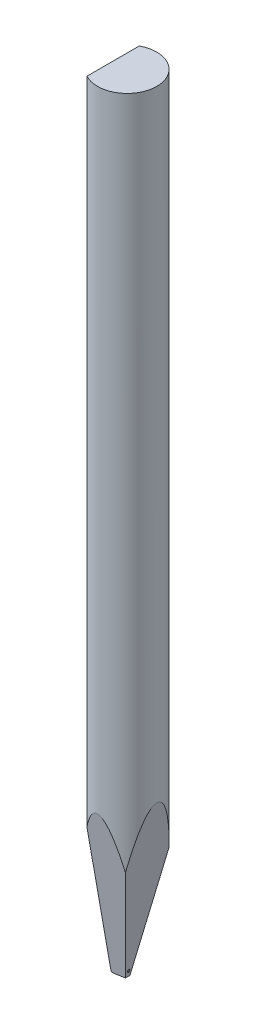
ISO-10303-21;
HEADER;
FILE_DESCRIPTION(('STEP AP214'),'2;1');
FILE_NAME('part.step','',(''),(''),'','','');
FILE_SCHEMA(('AUTOMOTIVE_DESIGN { 1 0 10303 214 1 1 1 1 }'));
ENDSEC;
DATA;
#1=APPLICATION_CONTEXT('core data for automotive mechanical design processes');
#2=APPLICATION_PROTOCOL_DEFINITION('international standard','automotive_design',2000,#1);
#3=PRODUCT_CONTEXT('',#1,'mechanical');
#4=PRODUCT('Part','Part','',(#3));
#5=PRODUCT_RELATED_PRODUCT_CATEGORY('part','',(#4));
#6=PRODUCT_DEFINITION_FORMATION('','',#4);
#7=PRODUCT_DEFINITION_CONTEXT('part definition',#1,'design');
#8=PRODUCT_DEFINITION('design','',#6,#7);
#9=PRODUCT_DEFINITION_SHAPE('','',#8);
#10=(LENGTH_UNIT() NAMED_UNIT(*) SI_UNIT(.MILLI.,.METRE.));
#11=(NAMED_UNIT(*) PLANE_ANGLE_UNIT() SI_UNIT($,.RADIAN.));
#12=(NAMED_UNIT(*) SI_UNIT($,.STERADIAN.) SOLID_ANGLE_UNIT());
#13=UNCERTAINTY_MEASURE_WITH_UNIT(LENGTH_MEASURE(1.E-05),#10,'distance_accuracy_value','');
#14=(GEOMETRIC_REPRESENTATION_CONTEXT(3) GLOBAL_UNCERTAINTY_ASSIGNED_CONTEXT((#13)) GLOBAL_UNIT_ASSIGNED_CONTEXT((#10,
#11,#12)) REPRESENTATION_CONTEXT('',''));
#15=CARTESIAN_POINT('',(0.,0.,0.));
#16=DIRECTION('',(0.,0.,1.));
#17=DIRECTION('',(1.,0.,0.));
#18=AXIS2_PLACEMENT_3D('',#15,#16,#17);
#19=CARTESIAN_POINT('',(0.,0.,0.));
#20=DIRECTION('',(0.,1.,0.));
#21=DIRECTION('',(0.,0.,1.));
#22=AXIS2_PLACEMENT_3D('',#19,#20,#21);
#23=PLANE('',#22);
#24=DIRECTION('',(1.,0.,0.));
#25=VECTOR('',#24,1.);
#26=CARTESIAN_POINT('',(-0.37592,0.,0.01397));
#27=LINE('',#26,#25);
#28=CARTESIAN_POINT('',(-0.34798,0.,0.0139699999999995));
#29=VERTEX_POINT('',#28);
#30=CARTESIAN_POINT('',(-0.305045479258089,0.,0.01397));
#31=VERTEX_POINT('',#30);
#32=EDGE_CURVE('E374',#29,#31,#27,.T.);
#33=ORIENTED_EDGE('',*,*,#32,.T.);
#34=CARTESIAN_POINT('',(-0.280550606325167,0.,0.));
#35=DIRECTION('',(0.,1.,0.));
#36=DIRECTION('',(-1.,0.,0.));
#37=AXIS2_PLACEMENT_3D('',#34,#35,#36);
#38=ELLIPSE('',#37,0.0293293936748331,0.0254);
#39=CARTESIAN_POINT('',(-0.28702,0.,0.024774386150013));
#40=VERTEX_POINT('',#39);
#41=EDGE_CURVE('E200',#40,#31,#38,.F.);
#42=ORIENTED_EDGE('',*,*,#41,.F.);
#43=DIRECTION('',(0.,0.,-1.));
#44=VECTOR('',#43,1.);
#45=CARTESIAN_POINT('',(-0.28702,0.,27.2760283406468));
#46=LINE('',#45,#44);
#47=CARTESIAN_POINT('',(-0.287019999999996,0.,0.0508));
#48=VERTEX_POINT('',#47);
#49=EDGE_CURVE('E271',#48,#40,#46,.T.);
#50=ORIENTED_EDGE('',*,*,#49,.F.);
#51=DIRECTION('',(-1.,0.,0.));
#52=VECTOR('',#51,1.);
#53=CARTESIAN_POINT('',(26.8738719491216,0.,0.0508));
#54=LINE('',#53,#52);
#55=CARTESIAN_POINT('',(-0.34798,0.,0.0508000000000009));
#56=VERTEX_POINT('',#55);
#57=EDGE_CURVE('E289',#48,#56,#54,.T.);
#58=ORIENTED_EDGE('',*,*,#57,.T.);
#59=DIRECTION('',(0.,0.,-1.));
#60=VECTOR('',#59,1.);
#61=CARTESIAN_POINT('',(-0.34798,0.,26.4674719491216));
#62=LINE('',#61,#60);
#63=EDGE_CURVE('E365',#56,#29,#62,.T.);
#64=ORIENTED_EDGE('',*,*,#63,.T.);
#65=EDGE_LOOP('',(#33,#42,#50,#58,#64));
#66=FACE_BOUND('',#65,.T.);
#67=ADVANCED_FACE('F43',(#66),#23,.F.);
#68=CARTESIAN_POINT('',(26.8738719491216,0.,0.0508));
#69=DIRECTION('',(0.,-0.173648177666931,0.984807753012208));
#70=DIRECTION('',(0.,-0.984807753012208,-0.173648177666931));
#71=AXIS2_PLACEMENT_3D('',#68,#69,#70);
#72=PLANE('',#71);
#73=CARTESIAN_POINT('',(-0.34798,0.02794,0.0557265758409954));
#74=DIRECTION('',(0.,-0.173648177666931,0.984807753012208));
#75=DIRECTION('',(0.,-0.984807753012208,-0.173648177666931));
#76=AXIS2_PLACEMENT_3D('',#73,#74,#75);
#77=ELLIPSE('',#76,0.0283710195360877,0.02794);
#78=CARTESIAN_POINT('',(-0.37592,0.02794,0.0557265758409954));
#79=VERTEX_POINT('',#78);
#80=EDGE_CURVE('E277',#56,#79,#77,.F.);
#81=ORIENTED_EDGE('',*,*,#80,.F.);
#82=ORIENTED_EDGE('',*,*,#57,.F.);
#83=DIRECTION('',(-0.984346441568213,-0.173566836012845,-0.0306045161452665));
#84=VECTOR('',#83,1.);
#85=CARTESIAN_POINT('',(26.0301980698046,4.64043560289492,0.869033999030531));
#86=LINE('',#85,#84);
#87=CARTESIAN_POINT('',(0.0144531636701099,0.0531578527145794,0.060173163670107));
#88=VERTEX_POINT('',#87);
#89=EDGE_CURVE('E286',#88,#48,#86,.T.);
#90=ORIENTED_EDGE('',*,*,#89,.F.);
#91=DIRECTION('',(-0.171087869746036,-0.970287525247814,-0.171087869746036));
#92=VECTOR('',#91,1.);
#93=CARTESIAN_POINT('',(0.791557999082992,4.46033837772866,0.837277999082991));
#94=LINE('',#93,#92);
#95=CARTESIAN_POINT('',(0.537041505266774,3.0169036135559,0.582761505266773));
#96=VERTEX_POINT('',#95);
#97=EDGE_CURVE('E283',#96,#88,#94,.T.);
#98=ORIENTED_EDGE('',*,*,#97,.F.);
#99=CARTESIAN_POINT('',(0.,-0.288101116436578,0.));
#100=DIRECTION('',(0.,-0.173648177666931,0.984807753012208));
#101=DIRECTION('',(0.,-0.984807753012208,-0.173648177666931));
#102=AXIS2_PLACEMENT_3D('',#99,#100,#101);
#103=ELLIPSE('',#102,4.56371043248163,0.792479999999998);
#104=CARTESIAN_POINT('',(-0.37592,3.66844093071414,0.69764511322018));
#105=VERTEX_POINT('',#104);
#106=EDGE_CURVE('E293',#96,#105,#103,.T.);
#107=ORIENTED_EDGE('',*,*,#106,.T.);
#108=DIRECTION('',(0.,0.984807753012208,0.173648177666931));
#109=VECTOR('',#108,1.);
#110=CARTESIAN_POINT('',(-0.37592,20.2093857917021,3.6142599786234));
#111=LINE('',#110,#109);
#112=EDGE_CURVE('E308',#79,#105,#111,.T.);
#113=ORIENTED_EDGE('',*,*,#112,.F.);
#114=EDGE_LOOP('',(#81,#82,#90,#98,#107,#113));
#115=FACE_BOUND('',#114,.T.);
#116=ADVANCED_FACE('F238',(#115),#72,.T.);
#117=CARTESIAN_POINT('',(26.8738719491216,0.,-0.0508));
#118=DIRECTION('',(0.,-0.173648177666931,-0.984807753012208));
#119=DIRECTION('',(0.,0.984807753012208,-0.173648177666931));
#120=AXIS2_PLACEMENT_3D('',#117,#118,#119);
#121=PLANE('',#120);
#122=CARTESIAN_POINT('',(-0.34798,0.02794,-0.0557265758409919));
#123=DIRECTION('',(0.,-0.173648177666931,-0.984807753012208));
#124=DIRECTION('',(0.,0.984807753012208,-0.173648177666931));
#125=AXIS2_PLACEMENT_3D('',#122,#123,#124);
#126=ELLIPSE('',#125,0.0283710195360877,0.02794);
#127=CARTESIAN_POINT('',(-0.37592,0.02794,-0.0557265758409919));
#128=VERTEX_POINT('',#127);
#129=CARTESIAN_POINT('',(-0.34798,0.,-0.0508000000000002));
#130=VERTEX_POINT('',#129);
#131=EDGE_CURVE('E318',#128,#130,#126,.F.);
#132=ORIENTED_EDGE('',*,*,#131,.F.);
#133=DIRECTION('',(0.,-0.984807753012208,0.173648177666931));
#134=VECTOR('',#133,1.);
#135=CARTESIAN_POINT('',(-0.37592,20.5673030312895,-3.67737044482337));
#136=LINE('',#135,#134);
#137=CARTESIAN_POINT('',(-0.37592,3.66844093071414,-0.69764511322018));
#138=VERTEX_POINT('',#137);
#139=EDGE_CURVE('E310',#138,#128,#136,.T.);
#140=ORIENTED_EDGE('',*,*,#139,.F.);
#141=CARTESIAN_POINT('',(0.,-0.288101116436578,0.));
#142=DIRECTION('',(0.,-0.173648177666931,-0.984807753012208));
#143=DIRECTION('',(0.,-0.984807753012208,0.173648177666931));
#144=AXIS2_PLACEMENT_3D('',#141,#142,#143);
#145=ELLIPSE('',#144,4.56371043248163,0.792479999999998);
#146=CARTESIAN_POINT('',(0.537041505266774,3.0169036135559,-0.582761505266773));
#147=VERTEX_POINT('',#146);
#148=EDGE_CURVE('E296',#138,#147,#145,.T.);
#149=ORIENTED_EDGE('',*,*,#148,.T.);
#150=DIRECTION('',(0.171087869746036,0.970287525247814,-0.171087869746036));
#151=VECTOR('',#150,1.);
#152=CARTESIAN_POINT('',(0.791557999082992,4.46033837772866,-0.837277999082991));
#153=LINE('',#152,#151);
#154=CARTESIAN_POINT('',(0.0144531636701099,0.0531578527145794,-0.060173163670107));
#155=VERTEX_POINT('',#154);
#156=EDGE_CURVE('E313',#155,#147,#153,.T.);
#157=ORIENTED_EDGE('',*,*,#156,.F.);
#158=DIRECTION('',(0.984346441568213,0.173566836012845,-0.0306045161452665));
#159=VECTOR('',#158,1.);
#160=CARTESIAN_POINT('',(26.0301980698046,4.64043560289492,-0.869033999030531));
#161=LINE('',#160,#159);
#162=CARTESIAN_POINT('',(-0.287019999999996,0.,-0.0508));
#163=VERTEX_POINT('',#162);
#164=EDGE_CURVE('E316',#163,#155,#161,.T.);
#165=ORIENTED_EDGE('',*,*,#164,.F.);
#166=DIRECTION('',(-1.,0.,0.));
#167=VECTOR('',#166,1.);
#168=CARTESIAN_POINT('',(26.8738719491216,0.,-0.0508));
#169=LINE('',#168,#167);
#170=EDGE_CURVE('E266',#163,#130,#169,.T.);
#171=ORIENTED_EDGE('',*,*,#170,.T.);
#172=EDGE_LOOP('',(#132,#140,#149,#157,#165,#171));
#173=FACE_BOUND('',#172,.T.);
#174=ADVANCED_FACE('F244',(#173),#121,.T.);
#175=CARTESIAN_POINT('',(-0.28702,0.,-0.024774386150013));
#176=VERTEX_POINT('',#175);
#177=EDGE_CURVE('E262',#176,#163,#46,.T.);
#178=ORIENTED_EDGE('',*,*,#177,.F.);
#179=CARTESIAN_POINT('',(-0.305045479258089,0.,-0.01397));
#180=VERTEX_POINT('',#179);
#181=EDGE_CURVE('E198',#180,#176,#38,.F.);
#182=ORIENTED_EDGE('',*,*,#181,.F.);
#183=DIRECTION('',(1.,0.,0.));
#184=VECTOR('',#183,1.);
#185=CARTESIAN_POINT('',(-0.37592,0.,-0.01397));
#186=LINE('',#185,#184);
#187=CARTESIAN_POINT('',(-0.34798,0.,-0.013970000000003));
#188=VERTEX_POINT('',#187);
#189=EDGE_CURVE('E372',#188,#180,#186,.T.);
#190=ORIENTED_EDGE('',*,*,#189,.F.);
#191=EDGE_CURVE('E368',#188,#130,#62,.T.);
#192=ORIENTED_EDGE('',*,*,#191,.T.);
#193=ORIENTED_EDGE('',*,*,#170,.F.);
#194=EDGE_LOOP('',(#178,#182,#190,#192,#193));
#195=FACE_BOUND('',#194,.T.);
#196=ADVANCED_FACE('F240',(#195),#23,.F.);
#197=CARTESIAN_POINT('',(0.,21.0312,0.));
#198=DIRECTION('',(0.,-1.,0.));
#199=DIRECTION('',(0.,0.,-1.));
#200=AXIS2_PLACEMENT_3D('',#197,#198,#199);
#201=CYLINDRICAL_SURFACE('',#200,0.792479999999998);
#202=ORIENTED_EDGE('',*,*,#106,.F.);
#203=CARTESIAN_POINT('',(0.,-0.0288101116436568,0.));
#204=DIRECTION('',(-0.984807753012208,0.173648177666931,0.));
#205=DIRECTION('',(-0.173648177666931,-0.984807753012208,0.));
#206=AXIS2_PLACEMENT_3D('',#203,#204,#205);
#207=ELLIPSE('',#206,4.56371043248164,0.792479999999998);
#208=EDGE_CURVE('E275',#96,#147,#207,.T.);
#209=ORIENTED_EDGE('',*,*,#208,.T.);
#210=ORIENTED_EDGE('',*,*,#148,.F.);
#211=DIRECTION('',(0.,-1.,0.));
#212=VECTOR('',#211,1.);
#213=CARTESIAN_POINT('',(-0.37592,21.0312,-0.69764511322018));
#214=LINE('',#213,#212);
#215=CARTESIAN_POINT('',(-0.37592,21.0312,-0.69764511322018));
#216=VERTEX_POINT('',#215);
#217=EDGE_CURVE('E302',#216,#138,#214,.T.);
#218=ORIENTED_EDGE('',*,*,#217,.F.);
#219=CARTESIAN_POINT('',(0.,21.0312,0.));
#220=DIRECTION('',(0.,1.,0.));
#221=DIRECTION('',(0.,0.,1.));
#222=AXIS2_PLACEMENT_3D('',#219,#220,#221);
#223=CIRCLE('',#222,0.792479999999998);
#224=CARTESIAN_POINT('',(-0.37592,21.0312,0.69764511322018));
#225=VERTEX_POINT('',#224);
#226=EDGE_CURVE('E305',#225,#216,#223,.T.);
#227=ORIENTED_EDGE('',*,*,#226,.F.);
#228=DIRECTION('',(0.,-1.,0.));
#229=VECTOR('',#228,1.);
#230=CARTESIAN_POINT('',(-0.37592,21.0312,0.69764511322018));
#231=LINE('',#230,#229);
#232=EDGE_CURVE('E300',#105,#225,#231,.F.);
#233=ORIENTED_EDGE('',*,*,#232,.F.);
#234=EDGE_LOOP('',(#202,#209,#210,#218,#227,#233));
#235=FACE_BOUND('',#234,.T.);
#236=ADVANCED_FACE('F45',(#235),#201,.T.);
#237=CARTESIAN_POINT('',(-0.37592,21.0312,-1.04648));
#238=DIRECTION('',(-1.,0.,0.));
#239=DIRECTION('',(0.,0.,1.));
#240=AXIS2_PLACEMENT_3D('',#237,#238,#239);
#241=PLANE('',#240);
#242=DIRECTION('',(0.,0.,-1.));
#243=VECTOR('',#242,1.);
#244=CARTESIAN_POINT('',(-0.37592,0.02794,26.4674719491216));
#245=LINE('',#244,#243);
#246=EDGE_CURVE('E356',#79,#128,#245,.T.);
#247=ORIENTED_EDGE('',*,*,#246,.F.);
#248=ORIENTED_EDGE('',*,*,#112,.T.);
#249=ORIENTED_EDGE('',*,*,#232,.T.);
#250=DIRECTION('',(0.,0.,-1.));
#251=VECTOR('',#250,1.);
#252=CARTESIAN_POINT('',(-0.37592,21.0312,-1.04648));
#253=LINE('',#252,#251);
#254=EDGE_CURVE('E298',#225,#216,#253,.T.);
#255=ORIENTED_EDGE('',*,*,#254,.T.);
#256=ORIENTED_EDGE('',*,*,#217,.T.);
#257=ORIENTED_EDGE('',*,*,#139,.T.);
#258=EDGE_LOOP('',(#247,#248,#249,#255,#256,#257));
#259=FACE_BOUND('',#258,.T.);
#260=ADVANCED_FACE('F255',(#259),#241,.T.);
#261=CARTESIAN_POINT('',(0.,21.0312,0.));
#262=DIRECTION('',(0.,1.,0.));
#263=DIRECTION('',(0.,0.,1.));
#264=AXIS2_PLACEMENT_3D('',#261,#262,#263);
#265=PLANE('',#264);
#266=ORIENTED_EDGE('',*,*,#226,.T.);
#267=ORIENTED_EDGE('',*,*,#254,.F.);
#268=EDGE_LOOP('',(#266,#267));
#269=FACE_BOUND('',#268,.T.);
#270=ADVANCED_FACE('F340',(#269),#265,.T.);
#271=CARTESIAN_POINT('',(-0.28702,0.,27.2760283406468));
#272=DIRECTION('',(-0.173648177666931,0.984807753012208,0.));
#273=DIRECTION('',(-0.984807753012208,-0.173648177666931,0.));
#274=AXIS2_PLACEMENT_3D('',#271,#272,#273);
#275=PLANE('',#274);
#276=ORIENTED_EDGE('',*,*,#49,.T.);
#277=CARTESIAN_POINT('',(-0.279817360080556,0.00127001975012591,0.));
#278=DIRECTION('',(-0.173648177666931,0.984807753012208,0.));
#279=DIRECTION('',(-0.984807753012208,-0.173648177666931,0.));
#280=AXIS2_PLACEMENT_3D('',#277,#278,#279);
#281=ELLIPSE('',#280,0.03315734514904,0.0254);
#282=CARTESIAN_POINT('',(-0.279817360080556,0.00127001975012593,0.0253999999999992));
#283=VERTEX_POINT('',#282);
#284=EDGE_CURVE('E381',#40,#283,#281,.T.);
#285=ORIENTED_EDGE('',*,*,#284,.T.);
#286=DIRECTION('',(-0.984807753012208,-0.173648177666931,0.));
#287=VECTOR('',#286,1.);
#288=CARTESIAN_POINT('',(-0.28702,0.,0.0253999999999983));
#289=LINE('',#288,#287);
#290=CARTESIAN_POINT('',(-0.11938,0.0295594550459672,0.0253999999999992));
#291=VERTEX_POINT('',#290);
#292=EDGE_CURVE('E11',#291,#283,#289,.T.);
#293=ORIENTED_EDGE('',*,*,#292,.F.);
#294=DIRECTION('',(0.,0.,1.));
#295=VECTOR('',#294,1.);
#296=CARTESIAN_POINT('',(-0.11938,0.0295594550459672,27.2760283406468));
#297=LINE('',#296,#295);
#298=CARTESIAN_POINT('',(-0.11938,0.0295594550459672,-0.0253999999999992));
#299=VERTEX_POINT('',#298);
#300=EDGE_CURVE('E51',#299,#291,#297,.T.);
#301=ORIENTED_EDGE('',*,*,#300,.F.);
#302=DIRECTION('',(-0.984807753012208,-0.173648177666931,0.));
#303=VECTOR('',#302,1.);
#304=CARTESIAN_POINT('',(-0.28702,0.,-0.0253999999999983));
#305=LINE('',#304,#303);
#306=CARTESIAN_POINT('',(-0.279817360080556,0.00127001975012592,-0.0253999999999992));
#307=VERTEX_POINT('',#306);
#308=EDGE_CURVE('E387',#299,#307,#305,.T.);
#309=ORIENTED_EDGE('',*,*,#308,.T.);
#310=EDGE_CURVE('E378',#307,#176,#281,.T.);
#311=ORIENTED_EDGE('',*,*,#310,.T.);
#312=ORIENTED_EDGE('',*,*,#177,.T.);
#313=ORIENTED_EDGE('',*,*,#164,.T.);
#314=DIRECTION('',(0.,0.,-1.));
#315=VECTOR('',#314,1.);
#316=CARTESIAN_POINT('',(0.014453163670107,0.0531578527145792,27.2760283406468));
#317=LINE('',#316,#315);
#318=EDGE_CURVE('E272',#88,#155,#317,.T.);
#319=ORIENTED_EDGE('',*,*,#318,.F.);
#320=ORIENTED_EDGE('',*,*,#89,.T.);
#321=EDGE_LOOP('',(#276,#285,#293,#301,#309,#311,#312,#313,#319,#320));
#322=FACE_BOUND('',#321,.T.);
#323=ADVANCED_FACE('F337',(#322),#275,.F.);
#324=CARTESIAN_POINT('',(0.014453163670107,0.0531578527145792,27.2760283406468));
#325=DIRECTION('',(-0.984807753012208,0.173648177666931,0.));
#326=DIRECTION('',(-0.173648177666931,-0.984807753012208,0.));
#327=AXIS2_PLACEMENT_3D('',#324,#325,#326);
#328=PLANE('',#327);
#329=CARTESIAN_POINT('',(0.0402883872120424,0.199676686293717,0.));
#330=DIRECTION('',(-0.984807753012208,0.173648177666931,0.));
#331=DIRECTION('',(0.173648177666931,0.984807753012208,0.));
#332=AXIS2_PLACEMENT_3D('',#329,#330,#331);
#333=ELLIPSE('',#332,0.0439502823592256,0.0315688581959235);
#334=CARTESIAN_POINT('',(0.047920273651669,0.242959265108158,0.));
#335=VERTEX_POINT('',#334);
#336=EDGE_CURVE('E379',#335,#335,#333,.F.);
#337=ORIENTED_EDGE('',*,*,#336,.F.);
#338=EDGE_LOOP('',(#337));
#339=FACE_BOUND('',#338,.T.);
#340=ORIENTED_EDGE('',*,*,#208,.F.);
#341=ORIENTED_EDGE('',*,*,#97,.T.);
#342=ORIENTED_EDGE('',*,*,#318,.T.);
#343=ORIENTED_EDGE('',*,*,#156,.T.);
#344=EDGE_LOOP('',(#340,#341,#342,#343));
#345=FACE_BOUND('',#344,.T.);
#346=ADVANCED_FACE('F233',(#339,#345),#328,.F.);
#347=CARTESIAN_POINT('',(-0.34798,0.02794,26.4674719491216));
#348=DIRECTION('',(0.,0.,-1.));
#349=DIRECTION('',(-1.,0.,0.));
#350=AXIS2_PLACEMENT_3D('',#347,#348,#349);
#351=CYLINDRICAL_SURFACE('',#350,0.02794);
#352=CARTESIAN_POINT('',(-0.368480727088346,0.00895674978173724,-0.00879881810244991));
#353=CARTESIAN_POINT('',(-0.368854774724931,0.00935976213087604,-0.00856686636913884));
#354=CARTESIAN_POINT('',(-0.369205920385678,0.00976379663737835,-0.00829596597274839));
#355=CARTESIAN_POINT('',(-0.369857818758494,0.010554396733079,-0.00767372073436362));
#356=CARTESIAN_POINT('',(-0.370158305071735,0.0109408626172578,-0.00732197229549094));
#357=CARTESIAN_POINT('',(-0.370701856645062,0.01167429232799,-0.00653564687871307));
#358=CARTESIAN_POINT('',(-0.370944592824748,0.0120210241938298,-0.00610061955934292));
#359=CARTESIAN_POINT('',(-0.371366457992628,0.0126475272360928,-0.00515919525147595));
#360=CARTESIAN_POINT('',(-0.371545766962167,0.0129274871364501,-0.00465300599824719));
#361=CARTESIAN_POINT('',(-0.371824486416077,0.0133747658664782,-0.00364460054899485));
#362=CARTESIAN_POINT('',(-0.371930578538492,0.0135511663748692,-0.00314824035494683));
#363=CARTESIAN_POINT('',(-0.372093482711804,0.0138258440182353,-0.002126247539729));
#364=CARTESIAN_POINT('',(-0.372150274606221,0.0139240891979024,-0.0016006030390009));
#365=CARTESIAN_POINT('',(-0.372213134357784,0.0140330808724955,-0.000570843051677341));
#366=CARTESIAN_POINT('',(-0.372222152063364,0.0140489147468615,-6.74367588038002E-05));
#367=CARTESIAN_POINT('',(-0.372197542657495,0.0140060535722678,0.000935057894392957));
#368=CARTESIAN_POINT('',(-0.372163925783508,0.0139473764149733,0.00143414726233205));
#369=CARTESIAN_POINT('',(-0.372054275035741,0.0137595786600333,0.00240799336092322));
#370=CARTESIAN_POINT('',(-0.371978732327494,0.0136312741337609,0.00288296359185759));
#371=CARTESIAN_POINT('',(-0.371785034498382,0.0133113058396997,0.00380146555967887));
#372=CARTESIAN_POINT('',(-0.371666903173099,0.0131196774578905,0.00424501468725538));
#373=CARTESIAN_POINT('',(-0.371385478248573,0.0126790651972169,0.00509691567190567));
#374=CARTESIAN_POINT('',(-0.371221477601541,0.0124291945057395,0.00550457321363247));
#375=CARTESIAN_POINT('',(-0.370849707894375,0.0118860628000233,0.00626872638313864));
#376=CARTESIAN_POINT('',(-0.37064185773786,0.0115927216938447,0.0066251251287556));
#377=CARTESIAN_POINT('',(-0.370144061183362,0.0109224002678549,0.00733922493729802));
#378=CARTESIAN_POINT('',(-0.369846095818338,0.0105398051087974,0.00768599572890581));
#379=CARTESIAN_POINT('',(-0.369199706905503,0.00975665930080781,0.00830076265321161));
#380=CARTESIAN_POINT('',(-0.368851429147325,0.00935616276418312,0.0085689798343934));
#381=CARTESIAN_POINT('',(-0.36848072714281,0.00895674981942643,0.00879881817577789));
#382=B_SPLINE_CURVE_WITH_KNOTS('',3,(#352,#353,#354,#355,#356,#357,#358,#359,#360,#361,#362,
#363,#364,#365,#366,#367,#368,#369,#370,#371,#372,#373,#374,#375,#376,#377,#378,#379,#380,#381),
.UNSPECIFIED.,.F.,.F.,(4,2,2,2,2,2,2,2,2,2,2,2,2,2,4),(0.,0.00179098902035531,
0.00359112076126628,0.00540127694248479,0.0072062546147293,0.00880987907805131,
0.0104141588775389,0.0119181182528348,0.0134217165641445,0.014908060947779,0.0163935761484805,
0.0179033875717668,0.0194160161479947,0.0211963214051743,0.0229715676894523),.UNSPECIFIED.);
#383=CARTESIAN_POINT('',(-0.368480727088347,0.00895674978173724,-0.00879881810244991));
#384=VERTEX_POINT('',#383);
#385=CARTESIAN_POINT('',(-0.368480727088346,0.00895674978173724,0.00879881810244991));
#386=VERTEX_POINT('',#385);
#387=EDGE_CURVE('E324',#384,#386,#382,.T.);
#388=ORIENTED_EDGE('',*,*,#387,.T.);
#389=CARTESIAN_POINT('',(-0.34798,0.02794,-0.0021611665211585));
#390=DIRECTION('',(0.,0.499999999999998,0.86602540378444));
#391=DIRECTION('',(0.,0.86602540378444,-0.499999999999998));
#392=AXIS2_PLACEMENT_3D('',#389,#390,#391);
#393=ELLIPSE('',#392,0.0322623330423162,0.02794);
#394=EDGE_CURVE('E331',#386,#29,#393,.T.);
#395=ORIENTED_EDGE('',*,*,#394,.T.);
#396=ORIENTED_EDGE('',*,*,#63,.F.);
#397=ORIENTED_EDGE('',*,*,#80,.T.);
#398=ORIENTED_EDGE('',*,*,#246,.T.);
#399=ORIENTED_EDGE('',*,*,#131,.T.);
#400=ORIENTED_EDGE('',*,*,#191,.F.);
#401=CARTESIAN_POINT('',(-0.34798,0.02794,0.00216116652115503));
#402=DIRECTION('',(0.,0.499999999999998,-0.86602540378444));
#403=DIRECTION('',(0.,-0.86602540378444,-0.499999999999998));
#404=AXIS2_PLACEMENT_3D('',#401,#402,#403);
#405=ELLIPSE('',#404,0.0322623330423162,0.02794);
#406=EDGE_CURVE('E321',#188,#384,#405,.T.);
#407=ORIENTED_EDGE('',*,*,#406,.T.);
#408=EDGE_LOOP('',(#388,#395,#396,#397,#398,#399,#400,#407));
#409=FACE_BOUND('',#408,.T.);
#410=ADVANCED_FACE('F225',(#409),#351,.T.);
#411=CARTESIAN_POINT('',(-0.37592,0.,0.01397));
#412=DIRECTION('',(0.,0.499999999999998,0.86602540378444));
#413=DIRECTION('',(0.,-0.86602540378444,0.499999999999998));
#414=AXIS2_PLACEMENT_3D('',#411,#412,#413);
#415=PLANE('',#414);
#416=DIRECTION('',(1.,0.,0.));
#417=VECTOR('',#416,1.);
#418=CARTESIAN_POINT('',(-0.37592,0.00895674978173724,0.00879881810244991));
#419=LINE('',#418,#417);
#420=CARTESIAN_POINT('',(-0.302892834492471,0.00895674977825219,0.00879881810446201));
#421=VERTEX_POINT('',#420);
#422=EDGE_CURVE('E375',#386,#421,#419,.T.);
#423=ORIENTED_EDGE('',*,*,#422,.T.);
#424=CARTESIAN_POINT('',(-0.266580606325167,0.0241967497817373,0.));
#425=DIRECTION('',(0.,0.499999999999998,0.86602540378444));
#426=DIRECTION('',(-0.554700196225233,-0.720576692122891,0.416025147168919));
#427=AXIS2_PLACEMENT_3D('',#424,#425,#426);
#428=ELLIPSE('',#427,0.0586587873496664,0.0254);
#429=EDGE_CURVE('E208',#421,#31,#428,.T.);
#430=ORIENTED_EDGE('',*,*,#429,.T.);
#431=ORIENTED_EDGE('',*,*,#32,.F.);
#432=ORIENTED_EDGE('',*,*,#394,.F.);
#433=EDGE_LOOP('',(#423,#430,#431,#432));
#434=FACE_BOUND('',#433,.T.);
#435=ADVANCED_FACE('F223',(#434),#415,.F.);
#436=CARTESIAN_POINT('',(-0.37592,0.00387674978173726,0.));
#437=DIRECTION('',(1.,0.,0.));
#438=DIRECTION('',(0.,0.,-1.));
#439=AXIS2_PLACEMENT_3D('',#436,#437,#438);
#440=CYLINDRICAL_SURFACE('',#439,0.01016);
#441=DIRECTION('',(1.,0.,0.));
#442=VECTOR('',#441,1.);
#443=CARTESIAN_POINT('',(-0.37592,0.00895674978173724,-0.00879881810244991));
#444=LINE('',#443,#442);
#445=CARTESIAN_POINT('',(-0.302892834491317,0.00895674978173724,-0.00879881810244991));
#446=VERTEX_POINT('',#445);
#447=EDGE_CURVE('E65',#384,#446,#444,.T.);
#448=ORIENTED_EDGE('',*,*,#447,.T.);
#449=CARTESIAN_POINT('',(-0.302892834491317,0.00895674978173674,-0.0087988181024502));
#450=CARTESIAN_POINT('',(-0.302739943050583,0.00941735974574272,-0.00853381110317959));
#451=CARTESIAN_POINT('',(-0.302608005377534,0.00986135171619135,-0.00822843561315786));
#452=CARTESIAN_POINT('',(-0.302380778864978,0.0107002844608467,-0.00754667304493423));
#453=CARTESIAN_POINT('',(-0.302285424202575,0.0110953124592045,-0.00717041534014014));
#454=CARTESIAN_POINT('',(-0.302125552407491,0.0118224551395683,-0.00635538878075599));
#455=CARTESIAN_POINT('',(-0.302061050495203,0.0121545387209327,-0.0059165892110389));
#456=CARTESIAN_POINT('',(-0.301955858096496,0.0127444430828301,-0.00498913583305599));
#457=CARTESIAN_POINT('',(-0.301915168377595,0.0130022614695008,-0.00450048041842561));
#458=CARTESIAN_POINT('',(-0.301851067836035,0.0134373405159187,-0.00348275190256002));
#459=CARTESIAN_POINT('',(-0.301827800737573,0.013613926567602,-0.00295338149596267));
#460=CARTESIAN_POINT('',(-0.30179432719949,0.0138782173570386,-0.00187241572500874));
#461=CARTESIAN_POINT('',(-0.301784123690592,0.0139659021495182,-0.00132081540215015));
#462=CARTESIAN_POINT('',(-0.301774260815354,0.0140504752256004,-0.000201768177356656));
#463=CARTESIAN_POINT('',(-0.301774771347384,0.0140459005448383,0.00036579128651018));
#464=CARTESIAN_POINT('',(-0.301786883538184,0.013942484242993,0.00149211612699328));
#465=CARTESIAN_POINT('',(-0.301798484865095,0.0138436454424987,0.00205088176623152));
#466=CARTESIAN_POINT('',(-0.301835668278414,0.0135542268308849,0.0031453692322399));
#467=CARTESIAN_POINT('',(-0.301861289947621,0.0133633874624329,0.00368102116241586));
#468=CARTESIAN_POINT('',(-0.301931852953639,0.0128957019649179,0.00471216320093632));
#469=CARTESIAN_POINT('',(-0.301976796912561,0.0126188441642258,0.00520764784756998));
#470=CARTESIAN_POINT('',(-0.302092512485198,0.0119910961003895,0.00613972310197045));
#471=CARTESIAN_POINT('',(-0.302163063848686,0.0116408476199903,0.00657677369924711));
#472=CARTESIAN_POINT('',(-0.302337373333965,0.0108775797277205,0.00738386059669966));
#473=CARTESIAN_POINT('',(-0.302441086215554,0.0104646462339143,0.00775398712648723));
#474=CARTESIAN_POINT('',(-0.302612761426613,0.00985650644583732,0.00821677131602318));
#475=CARTESIAN_POINT('',(-0.302664421027602,0.00968062590146413,0.00834187843897372));
#476=CARTESIAN_POINT('',(-0.302773923944439,0.00932294953927967,0.00857965202719807));
#477=CARTESIAN_POINT('',(-0.302831756689581,0.00914116419264679,0.00869233910822765));
#478=CARTESIAN_POINT('',(-0.302892834492505,0.00895674977827776,0.00879881810448311));
#479=B_SPLINE_CURVE_WITH_KNOTS('',3,(#449,#450,#451,#452,#453,#454,#455,#456,#457,#458,#459,
#460,#461,#462,#463,#464,#465,#466,#467,#468,#469,#470,#471,#472,#473,#474,#475,#476,#477,#478),
.UNSPECIFIED.,.F.,.F.,(4,2,2,2,2,2,2,2,2,2,2,2,2,2,4),(0.,0.00165649149420493,
0.0033099883681888,0.00496430011223509,0.00661866517535528,0.00828653161431018,
0.00995477216153838,0.0116494866121548,0.0133441503547942,0.0150436234121845,0.0167433271676665,
0.0184287453116495,0.0201118738848373,0.0207772668191028,0.021441538098197),.UNSPECIFIED.);
#480=EDGE_CURVE('E58',#446,#421,#479,.T.);
#481=ORIENTED_EDGE('',*,*,#480,.T.);
#482=ORIENTED_EDGE('',*,*,#422,.F.);
#483=ORIENTED_EDGE('',*,*,#387,.F.);
#484=EDGE_LOOP('',(#448,#481,#482,#483));
#485=FACE_BOUND('',#484,.T.);
#486=ADVANCED_FACE('F210',(#485),#440,.F.);
#487=CARTESIAN_POINT('',(-0.37592,0.00895674978173724,-0.00879881810244991));
#488=DIRECTION('',(0.,0.499999999999998,-0.86602540378444));
#489=DIRECTION('',(0.,0.86602540378444,0.499999999999998));
#490=AXIS2_PLACEMENT_3D('',#487,#488,#489);
#491=PLANE('',#490);
#492=ORIENTED_EDGE('',*,*,#189,.T.);
#493=CARTESIAN_POINT('',(-0.266580606325167,0.0241967497817373,0.));
#494=DIRECTION('',(0.,0.499999999999998,-0.86602540378444));
#495=DIRECTION('',(-0.554700196225233,-0.720576692122891,-0.416025147168919));
#496=AXIS2_PLACEMENT_3D('',#493,#494,#495);
#497=ELLIPSE('',#496,0.0586587873496664,0.0254);
#498=EDGE_CURVE('E386',#180,#446,#497,.T.);
#499=ORIENTED_EDGE('',*,*,#498,.T.);
#500=ORIENTED_EDGE('',*,*,#447,.F.);
#501=ORIENTED_EDGE('',*,*,#406,.F.);
#502=EDGE_LOOP('',(#492,#499,#500,#501));
#503=FACE_BOUND('',#502,.T.);
#504=ADVANCED_FACE('F231',(#503),#491,.F.);
#505=CARTESIAN_POINT('',(-0.11938,0.0939800000000001,0.0254));
#506=DIRECTION('',(-1.,0.,0.));
#507=DIRECTION('',(0.,0.,1.));
#508=AXIS2_PLACEMENT_3D('',#505,#506,#507);
#509=PLANE('',#508);
#510=ORIENTED_EDGE('',*,*,#300,.T.);
#511=DIRECTION('',(0.,1.,0.));
#512=VECTOR('',#511,1.);
#513=CARTESIAN_POINT('',(-0.11938,0.0939800000000001,0.0254));
#514=LINE('',#513,#512);
#515=CARTESIAN_POINT('',(-0.11938,0.0939800000000001,0.0254));
#516=VERTEX_POINT('',#515);
#517=EDGE_CURVE('E183',#291,#516,#514,.T.);
#518=ORIENTED_EDGE('',*,*,#517,.T.);
#519=DIRECTION('',(0.,0.,-1.));
#520=VECTOR('',#519,1.);
#521=CARTESIAN_POINT('',(-0.11938,0.0939800000000001,0.0254));
#522=LINE('',#521,#520);
#523=CARTESIAN_POINT('',(-0.11938,0.0939800000000001,0.01905));
#524=VERTEX_POINT('',#523);
#525=EDGE_CURVE('E170',#516,#524,#522,.T.);
#526=ORIENTED_EDGE('',*,*,#525,.T.);
#527=CARTESIAN_POINT('',(-0.11938,0.0939800000000001,0.));
#528=DIRECTION('',(1.,0.,0.));
#529=DIRECTION('',(0.,1.,0.));
#530=AXIS2_PLACEMENT_3D('',#527,#528,#529);
#531=ELLIPSE('',#530,0.0219970452561247,0.01905);
#532=CARTESIAN_POINT('',(-0.11938,0.0939800000000001,-0.0190499999999996));
#533=VERTEX_POINT('',#532);
#534=EDGE_CURVE('E162',#533,#524,#531,.F.);
#535=ORIENTED_EDGE('',*,*,#534,.F.);
#536=CARTESIAN_POINT('',(-0.11938,0.0939800000000001,-0.0254));
#537=VERTEX_POINT('',#536);
#538=EDGE_CURVE('E167',#533,#537,#522,.T.);
#539=ORIENTED_EDGE('',*,*,#538,.T.);
#540=DIRECTION('',(0.,1.,0.));
#541=VECTOR('',#540,1.);
#542=CARTESIAN_POINT('',(-0.11938,0.0939800000000001,-0.0254));
#543=LINE('',#542,#541);
#544=EDGE_CURVE('E190',#299,#537,#543,.T.);
#545=ORIENTED_EDGE('',*,*,#544,.F.);
#546=EDGE_LOOP('',(#510,#518,#526,#535,#539,#545));
#547=FACE_BOUND('',#546,.T.);
#548=ADVANCED_FACE('F164',(#547),#509,.T.);
#549=CARTESIAN_POINT('',(0.,0.,0.0254));
#550=DIRECTION('',(0.,0.,-1.));
#551=DIRECTION('',(-1.,0.,0.));
#552=AXIS2_PLACEMENT_3D('',#549,#550,#551);
#553=PLANE('',#552);
#554=ORIENTED_EDGE('',*,*,#292,.T.);
#555=DIRECTION('',(-0.500000000000004,-0.866025403784436,0.));
#556=VECTOR('',#555,1.);
#557=CARTESIAN_POINT('',(-0.210412954743874,0.121481976062362,0.0254));
#558=LINE('',#557,#556);
#559=CARTESIAN_POINT('',(-0.226291228026725,0.0939800000000001,0.0254));
#560=VERTEX_POINT('',#559);
#561=EDGE_CURVE('E185',#560,#283,#558,.T.);
#562=ORIENTED_EDGE('',*,*,#561,.F.);
#563=DIRECTION('',(-1.,0.,0.));
#564=VECTOR('',#563,1.);
#565=CARTESIAN_POINT('',(-0.255620621701558,0.0939800000000001,0.0254));
#566=LINE('',#565,#564);
#567=EDGE_CURVE('E186',#516,#560,#566,.T.);
#568=ORIENTED_EDGE('',*,*,#567,.F.);
#569=ORIENTED_EDGE('',*,*,#517,.F.);
#570=EDGE_LOOP('',(#554,#562,#568,#569));
#571=FACE_BOUND('',#570,.T.);
#572=ADVANCED_FACE('F394',(#571),#553,.T.);
#573=CARTESIAN_POINT('',(0.,0.,-0.0254));
#574=DIRECTION('',(0.,0.,-1.));
#575=DIRECTION('',(-1.,0.,0.));
#576=AXIS2_PLACEMENT_3D('',#573,#574,#575);
#577=PLANE('',#576);
#578=ORIENTED_EDGE('',*,*,#544,.T.);
#579=DIRECTION('',(-1.,0.,0.));
#580=VECTOR('',#579,1.);
#581=CARTESIAN_POINT('',(-0.255620621701558,0.0939800000000001,-0.0254));
#582=LINE('',#581,#580);
#583=CARTESIAN_POINT('',(-0.226291228026725,0.0939800000000001,-0.0254));
#584=VERTEX_POINT('',#583);
#585=EDGE_CURVE('E172',#537,#584,#582,.T.);
#586=ORIENTED_EDGE('',*,*,#585,.T.);
#587=DIRECTION('',(0.500000000000004,0.866025403784436,0.));
#588=VECTOR('',#587,1.);
#589=CARTESIAN_POINT('',(-0.226291228026725,0.0939800000000001,-0.0254));
#590=LINE('',#589,#588);
#591=EDGE_CURVE('E194',#307,#584,#590,.T.);
#592=ORIENTED_EDGE('',*,*,#591,.F.);
#593=ORIENTED_EDGE('',*,*,#308,.F.);
#594=EDGE_LOOP('',(#578,#586,#592,#593));
#595=FACE_BOUND('',#594,.T.);
#596=ADVANCED_FACE('F401',(#595),#577,.F.);
#597=CARTESIAN_POINT('',(0.0155766909287475,0.171897281836653,0.));
#598=DIRECTION('',(0.866025403784441,0.499999999999995,0.));
#599=DIRECTION('',(-0.499999999999995,0.866025403784441,0.));
#600=AXIS2_PLACEMENT_3D('',#597,#598,#599);
#601=CONICAL_SURFACE('',#600,0.01905,0.392699081698725);
#602=CARTESIAN_POINT('',(0.0155766909287475,0.171897281836653,0.));
#603=DIRECTION('',(0.866025403784441,0.499999999999995,0.));
#604=DIRECTION('',(-0.499999999999995,0.866025403784441,0.));
#605=AXIS2_PLACEMENT_3D('',#602,#603,#604);
#606=CIRCLE('',#605,0.01905);
#607=CARTESIAN_POINT('',(0.00605169092874757,0.188395065778746,0.));
#608=VERTEX_POINT('',#607);
#609=EDGE_CURVE('E178',#608,#608,#606,.T.);
#610=ORIENTED_EDGE('',*,*,#609,.F.);
#611=EDGE_LOOP('',(#610));
#612=FACE_BOUND('',#611,.T.);
#613=ORIENTED_EDGE('',*,*,#336,.T.);
#614=EDGE_LOOP('',(#613));
#615=FACE_BOUND('',#614,.T.);
#616=ADVANCED_FACE('F221',(#612,#615),#601,.F.);
#617=CARTESIAN_POINT('',(-0.226291228026725,0.0939800000000001,0.));
#618=DIRECTION('',(-0.500000000000004,-0.866025403784436,0.));
#619=DIRECTION('',(0.866025403784436,-0.500000000000004,0.));
#620=AXIS2_PLACEMENT_3D('',#617,#618,#619);
#621=CYLINDRICAL_SURFACE('',#620,0.0254);
#622=ORIENTED_EDGE('',*,*,#41,.T.);
#623=ORIENTED_EDGE('',*,*,#429,.F.);
#624=ORIENTED_EDGE('',*,*,#480,.F.);
#625=ORIENTED_EDGE('',*,*,#498,.F.);
#626=ORIENTED_EDGE('',*,*,#181,.T.);
#627=ORIENTED_EDGE('',*,*,#310,.F.);
#628=ORIENTED_EDGE('',*,*,#591,.T.);
#629=CARTESIAN_POINT('',(-0.226291228026725,0.0939800000000001,0.));
#630=DIRECTION('',(0.,-1.,0.));
#631=DIRECTION('',(-1.,0.,0.));
#632=AXIS2_PLACEMENT_3D('',#629,#630,#631);
#633=ELLIPSE('',#632,0.0293293936748331,0.0254);
#634=EDGE_CURVE('E196',#584,#560,#633,.F.);
#635=ORIENTED_EDGE('',*,*,#634,.T.);
#636=ORIENTED_EDGE('',*,*,#561,.T.);
#637=ORIENTED_EDGE('',*,*,#284,.F.);
#638=EDGE_LOOP('',(#622,#623,#624,#625,#626,#627,#628,#635,#636,#637));
#639=FACE_BOUND('',#638,.T.);
#640=ADVANCED_FACE('F215',(#639),#621,.F.);
#641=CARTESIAN_POINT('',(-0.255620621701558,0.0939800000000001,0.0254));
#642=DIRECTION('',(0.,-1.,0.));
#643=DIRECTION('',(0.,0.,-1.));
#644=AXIS2_PLACEMENT_3D('',#641,#642,#643);
#645=PLANE('',#644);
#646=ORIENTED_EDGE('',*,*,#585,.F.);
#647=ORIENTED_EDGE('',*,*,#538,.F.);
#648=CARTESIAN_POINT('',(-0.11938,0.0939800000000001,0.));
#649=DIRECTION('',(0.,1.,0.));
#650=DIRECTION('',(1.,0.,0.));
#651=AXIS2_PLACEMENT_3D('',#648,#649,#650);
#652=ELLIPSE('',#651,0.0381000000000004,0.01905);
#653=EDGE_CURVE('E173',#524,#533,#652,.F.);
#654=ORIENTED_EDGE('',*,*,#653,.F.);
#655=ORIENTED_EDGE('',*,*,#525,.F.);
#656=ORIENTED_EDGE('',*,*,#567,.T.);
#657=ORIENTED_EDGE('',*,*,#634,.F.);
#658=EDGE_LOOP('',(#646,#647,#654,#655,#656,#657));
#659=FACE_BOUND('',#658,.T.);
#660=ADVANCED_FACE('F180',(#659),#645,.T.);
#661=CARTESIAN_POINT('',(-0.352152304295355,-0.0404111525448111,0.));
#662=DIRECTION('',(0.866025403784441,0.499999999999995,0.));
#663=DIRECTION('',(-0.499999999999995,0.866025403784441,0.));
#664=AXIS2_PLACEMENT_3D('',#661,#662,#663);
#665=CYLINDRICAL_SURFACE('',#664,0.01905);
#666=ORIENTED_EDGE('',*,*,#534,.T.);
#667=ORIENTED_EDGE('',*,*,#653,.T.);
#668=EDGE_LOOP('',(#666,#667));
#669=FACE_BOUND('',#668,.T.);
#670=ORIENTED_EDGE('',*,*,#609,.T.);
#671=EDGE_LOOP('',(#670));
#672=FACE_BOUND('',#671,.T.);
#673=ADVANCED_FACE('F175',(#669,#672),#665,.F.);
#674=CLOSED_SHELL('',(#67,#116,#174,#196,#236,#260,#270,#323,#346,#410,#435,#486,#504,#548,#572,
#596,#616,#640,#660,#673));
#675=MANIFOLD_SOLID_BREP('B2',#674);
#676=ADVANCED_BREP_SHAPE_REPRESENTATION('',(#18,#675),#14);
#677=SHAPE_DEFINITION_REPRESENTATION(#9,#676);
ENDSEC;
END-ISO-10303-21;
